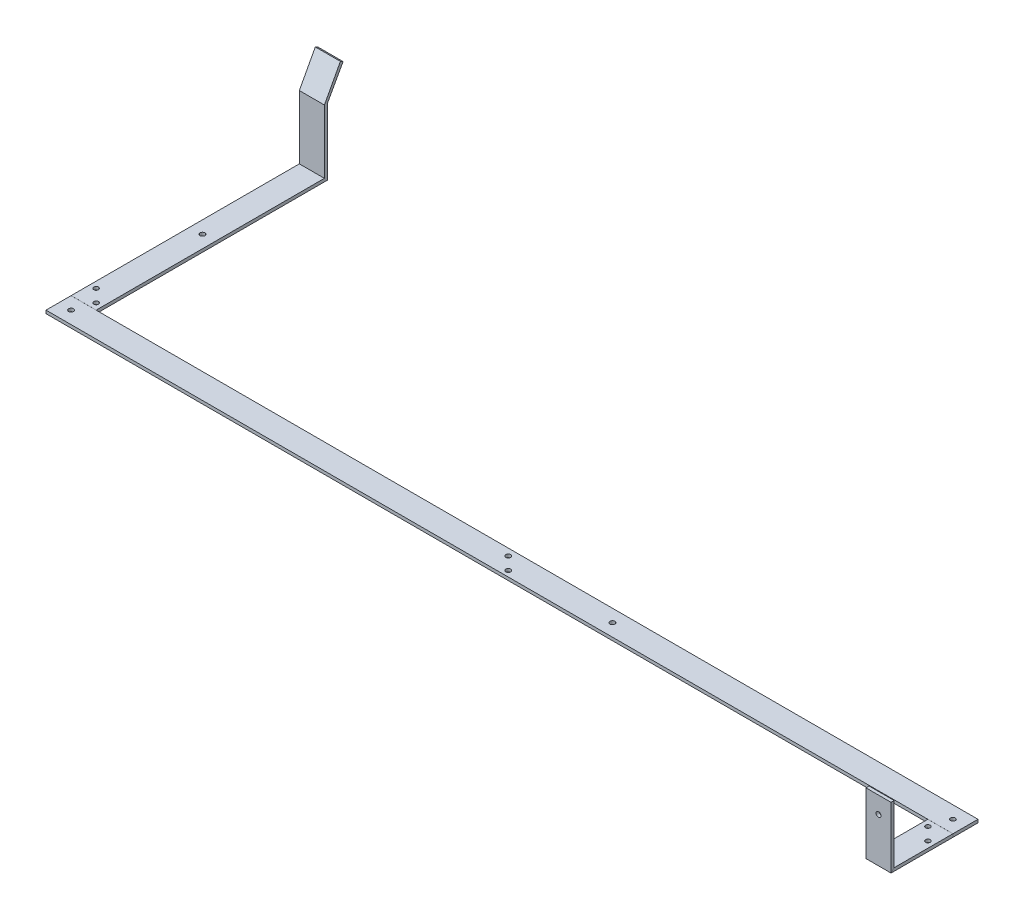
ISO-10303-21;
HEADER;
FILE_DESCRIPTION(('STEP AP214'),'2;1');
FILE_NAME('part.step','',(''),(''),'','','');
FILE_SCHEMA(('AUTOMOTIVE_DESIGN { 1 0 10303 214 1 1 1 1 }'));
ENDSEC;
DATA;
#1=APPLICATION_CONTEXT('core data for automotive mechanical design processes');
#2=APPLICATION_PROTOCOL_DEFINITION('international standard','automotive_design',2000,#1);
#3=PRODUCT_CONTEXT('',#1,'mechanical');
#4=PRODUCT('Part','Part','',(#3));
#5=PRODUCT_RELATED_PRODUCT_CATEGORY('part','',(#4));
#6=PRODUCT_DEFINITION_FORMATION('','',#4);
#7=PRODUCT_DEFINITION_CONTEXT('part definition',#1,'design');
#8=PRODUCT_DEFINITION('design','',#6,#7);
#9=PRODUCT_DEFINITION_SHAPE('','',#8);
#10=(LENGTH_UNIT() NAMED_UNIT(*) SI_UNIT(.MILLI.,.METRE.));
#11=(NAMED_UNIT(*) PLANE_ANGLE_UNIT() SI_UNIT($,.RADIAN.));
#12=(NAMED_UNIT(*) SI_UNIT($,.STERADIAN.) SOLID_ANGLE_UNIT());
#13=UNCERTAINTY_MEASURE_WITH_UNIT(LENGTH_MEASURE(1.E-05),#10,'distance_accuracy_value','');
#14=(GEOMETRIC_REPRESENTATION_CONTEXT(3) GLOBAL_UNCERTAINTY_ASSIGNED_CONTEXT((#13)) GLOBAL_UNIT_ASSIGNED_CONTEXT((#10,
#11,#12)) REPRESENTATION_CONTEXT('',''));
#15=CARTESIAN_POINT('',(0.,0.,0.));
#16=DIRECTION('',(0.,0.,1.));
#17=DIRECTION('',(1.,0.,0.));
#18=AXIS2_PLACEMENT_3D('',#15,#16,#17);
#19=CARTESIAN_POINT('',(-25.4,-67.5,6.31));
#20=DIRECTION('',(0.,1.,0.));
#21=DIRECTION('',(0.,0.,1.));
#22=AXIS2_PLACEMENT_3D('',#19,#20,#21);
#23=PLANE('',#22);
#24=CARTESIAN_POINT('',(1774.59999999998,-67.5,532.449999999998));
#25=DIRECTION('',(0.,-1.,0.));
#26=DIRECTION('',(0.,0.,-1.));
#27=AXIS2_PLACEMENT_3D('',#24,#25,#26);
#28=CIRCLE('',#27,4.76249999999989);
#29=CARTESIAN_POINT('',(1774.59999999998,-67.5,527.687499999998));
#30=VERTEX_POINT('',#29);
#31=EDGE_CURVE('E159',#30,#30,#28,.T.);
#32=ORIENTED_EDGE('',*,*,#31,.F.);
#33=EDGE_LOOP('',(#32));
#34=FACE_BOUND('',#33,.T.);
#35=CARTESIAN_POINT('',(1799.99999999998,-67.5,557.849999999998));
#36=DIRECTION('',(0.,-1.,0.));
#37=DIRECTION('',(0.,0.,-1.));
#38=AXIS2_PLACEMENT_3D('',#35,#36,#37);
#39=CIRCLE('',#38,4.76249999999989);
#40=CARTESIAN_POINT('',(1799.99999999998,-67.5,553.087499999998));
#41=VERTEX_POINT('',#40);
#42=EDGE_CURVE('E149',#41,#41,#39,.T.);
#43=ORIENTED_EDGE('',*,*,#42,.F.);
#44=EDGE_LOOP('',(#43));
#45=FACE_BOUND('',#44,.T.);
#46=DIRECTION('',(0.,0.,1.));
#47=VECTOR('',#46,1.);
#48=CARTESIAN_POINT('',(1761.9,-67.4999999999998,519.75));
#49=LINE('',#48,#47);
#50=CARTESIAN_POINT('',(1761.9,-67.4999999999998,519.85));
#51=VERTEX_POINT('',#50);
#52=CARTESIAN_POINT('',(1761.9,-67.4999999999998,645.215));
#53=VERTEX_POINT('',#52);
#54=EDGE_CURVE('E119',#51,#53,#49,.T.);
#55=ORIENTED_EDGE('',*,*,#54,.F.);
#56=DIRECTION('',(1.,0.,0.));
#57=VECTOR('',#56,1.);
#58=CARTESIAN_POINT('',(-25.4,-67.5,519.85));
#59=LINE('',#58,#57);
#60=CARTESIAN_POINT('',(1812.7,-67.4999999999998,519.85));
#61=VERTEX_POINT('',#60);
#62=EDGE_CURVE('E63',#51,#61,#59,.T.);
#63=ORIENTED_EDGE('',*,*,#62,.T.);
#64=DIRECTION('',(0.,0.,-1.));
#65=VECTOR('',#64,1.);
#66=CARTESIAN_POINT('',(1812.7,-67.4999999999998,468.95));
#67=LINE('',#66,#65);
#68=CARTESIAN_POINT('',(1812.7,-67.4999999999998,645.215));
#69=VERTEX_POINT('',#68);
#70=EDGE_CURVE('E140',#69,#61,#67,.T.);
#71=ORIENTED_EDGE('',*,*,#70,.F.);
#72=DIRECTION('',(-1.,0.,0.));
#73=VECTOR('',#72,1.);
#74=CARTESIAN_POINT('',(1761.9,-67.4999999999998,645.215));
#75=LINE('',#74,#73);
#76=EDGE_CURVE('E111',#69,#53,#75,.T.);
#77=ORIENTED_EDGE('',*,*,#76,.T.);
#78=EDGE_LOOP('',(#55,#63,#71,#77));
#79=FACE_BOUND('',#78,.T.);
#80=ADVANCED_FACE('F45',(#34,#45,#79),#23,.F.);
#81=CARTESIAN_POINT('',(-25.4,-61.19,519.75));
#82=DIRECTION('',(0.,-1.,0.));
#83=DIRECTION('',(0.,0.,-1.));
#84=AXIS2_PLACEMENT_3D('',#81,#82,#83);
#85=PLANE('',#84);
#86=CARTESIAN_POINT('',(1774.59999999998,-61.19,532.449999999998));
#87=DIRECTION('',(0.,-1.,0.));
#88=DIRECTION('',(0.,0.,-1.));
#89=AXIS2_PLACEMENT_3D('',#86,#87,#88);
#90=CIRCLE('',#89,4.76249999999989);
#91=CARTESIAN_POINT('',(1774.59999999998,-61.19,527.687499999998));
#92=VERTEX_POINT('',#91);
#93=EDGE_CURVE('E48',#92,#92,#90,.T.);
#94=ORIENTED_EDGE('',*,*,#93,.T.);
#95=EDGE_LOOP('',(#94));
#96=FACE_BOUND('',#95,.T.);
#97=CARTESIAN_POINT('',(1799.99999999998,-61.19,557.849999999998));
#98=DIRECTION('',(0.,-1.,0.));
#99=DIRECTION('',(0.,0.,-1.));
#100=AXIS2_PLACEMENT_3D('',#97,#98,#99);
#101=CIRCLE('',#100,4.76249999999989);
#102=CARTESIAN_POINT('',(1799.99999999998,-61.19,553.087499999998));
#103=VERTEX_POINT('',#102);
#104=EDGE_CURVE('E147',#103,#103,#101,.T.);
#105=ORIENTED_EDGE('',*,*,#104,.T.);
#106=EDGE_LOOP('',(#105));
#107=FACE_BOUND('',#106,.T.);
#108=DIRECTION('',(0.,0.,1.));
#109=VECTOR('',#108,1.);
#110=CARTESIAN_POINT('',(1812.7,-61.1899999999998,468.95));
#111=LINE('',#110,#109);
#112=CARTESIAN_POINT('',(1812.7,-61.19,519.85));
#113=VERTEX_POINT('',#112);
#114=CARTESIAN_POINT('',(1812.7,-61.1899999999998,638.905));
#115=VERTEX_POINT('',#114);
#116=EDGE_CURVE('E105',#113,#115,#111,.T.);
#117=ORIENTED_EDGE('',*,*,#116,.F.);
#118=DIRECTION('',(1.,0.,0.));
#119=VECTOR('',#118,1.);
#120=CARTESIAN_POINT('',(1812.7,-61.19,519.85));
#121=LINE('',#120,#119);
#122=CARTESIAN_POINT('',(1761.9,-61.19,519.85));
#123=VERTEX_POINT('',#122);
#124=EDGE_CURVE('E12',#123,#113,#121,.T.);
#125=ORIENTED_EDGE('',*,*,#124,.F.);
#126=DIRECTION('',(0.,0.,1.));
#127=VECTOR('',#126,1.);
#128=CARTESIAN_POINT('',(1761.9,-61.1899999999998,519.75));
#129=LINE('',#128,#127);
#130=CARTESIAN_POINT('',(1761.9,-61.1899999999998,638.905));
#131=VERTEX_POINT('',#130);
#132=EDGE_CURVE('E103',#123,#131,#129,.T.);
#133=ORIENTED_EDGE('',*,*,#132,.T.);
#134=DIRECTION('',(1.,0.,0.));
#135=VECTOR('',#134,1.);
#136=CARTESIAN_POINT('',(1761.9,-61.1899999999998,638.905));
#137=LINE('',#136,#135);
#138=EDGE_CURVE('E110',#131,#115,#137,.T.);
#139=ORIENTED_EDGE('',*,*,#138,.T.);
#140=EDGE_LOOP('',(#117,#125,#133,#139));
#141=FACE_BOUND('',#140,.T.);
#142=ADVANCED_FACE('F101',(#96,#107,#141),#85,.F.);
#143=CARTESIAN_POINT('',(1812.7,1.97302717093577E-13,0.));
#144=DIRECTION('',(1.,0.,0.));
#145=DIRECTION('',(0.,0.,-1.));
#146=AXIS2_PLACEMENT_3D('',#143,#144,#145);
#147=PLANE('',#146);
#148=DIRECTION('',(0.,1.,0.));
#149=VECTOR('',#148,1.);
#150=CARTESIAN_POINT('',(1812.7,-111.99,519.85));
#151=LINE('',#150,#149);
#152=EDGE_CURVE('E113',#61,#113,#151,.T.);
#153=ORIENTED_EDGE('',*,*,#152,.T.);
#154=ORIENTED_EDGE('',*,*,#116,.T.);
#155=DIRECTION('',(0.,-0.707106781186548,0.707106781186548));
#156=VECTOR('',#155,1.);
#157=CARTESIAN_POINT('',(1812.7,-1.61249999999979,579.3275));
#158=LINE('',#157,#156);
#159=EDGE_CURVE('E143',#115,#69,#158,.T.);
#160=ORIENTED_EDGE('',*,*,#159,.T.);
#161=ORIENTED_EDGE('',*,*,#70,.T.);
#162=EDGE_LOOP('',(#153,#154,#160,#161));
#163=FACE_BOUND('',#162,.T.);
#164=ADVANCED_FACE('F169',(#163),#147,.T.);
#165=CARTESIAN_POINT('',(1761.9,-67.9154999999999,638.905));
#166=DIRECTION('',(0.,0.,-1.));
#167=DIRECTION('',(-1.,0.,0.));
#168=AXIS2_PLACEMENT_3D('',#165,#166,#167);
#169=PLANE('',#168);
#170=CARTESIAN_POINT('',(1787.3,22.7162872600002,638.905));
#171=DIRECTION('',(0.,0.,-1.));
#172=DIRECTION('',(-1.,0.,0.));
#173=AXIS2_PLACEMENT_3D('',#170,#171,#172);
#174=CIRCLE('',#173,4.99999999999982);
#175=CARTESIAN_POINT('',(1782.3,22.7162872600002,638.905));
#176=VERTEX_POINT('',#175);
#177=EDGE_CURVE('E146',#176,#176,#174,.T.);
#178=ORIENTED_EDGE('',*,*,#177,.F.);
#179=EDGE_LOOP('',(#178));
#180=FACE_BOUND('',#179,.T.);
#181=DIRECTION('',(1.,0.,0.));
#182=VECTOR('',#181,1.);
#183=CARTESIAN_POINT('',(1739.7,56.7162872600002,638.905));
#184=LINE('',#183,#182);
#185=CARTESIAN_POINT('',(1761.9,56.7162872600002,638.905));
#186=VERTEX_POINT('',#185);
#187=CARTESIAN_POINT('',(1812.7,56.7162872600002,638.905));
#188=VERTEX_POINT('',#187);
#189=EDGE_CURVE('E134',#186,#188,#184,.T.);
#190=ORIENTED_EDGE('',*,*,#189,.T.);
#191=DIRECTION('',(0.,1.,0.));
#192=VECTOR('',#191,1.);
#193=CARTESIAN_POINT('',(1812.7,-67.9154999999999,638.905));
#194=LINE('',#193,#192);
#195=EDGE_CURVE('E122',#115,#188,#194,.T.);
#196=ORIENTED_EDGE('',*,*,#195,.F.);
#197=ORIENTED_EDGE('',*,*,#138,.F.);
#198=DIRECTION('',(0.,1.,0.));
#199=VECTOR('',#198,1.);
#200=CARTESIAN_POINT('',(1761.9,-67.9154999999999,638.905));
#201=LINE('',#200,#199);
#202=EDGE_CURVE('E126',#131,#186,#201,.T.);
#203=ORIENTED_EDGE('',*,*,#202,.T.);
#204=EDGE_LOOP('',(#190,#196,#197,#203));
#205=FACE_BOUND('',#204,.T.);
#206=ADVANCED_FACE('F176',(#180,#205),#169,.T.);
#207=CARTESIAN_POINT('',(1812.7,-67.9154999999999,638.905));
#208=DIRECTION('',(1.,0.,0.));
#209=DIRECTION('',(0.,0.,-1.));
#210=AXIS2_PLACEMENT_3D('',#207,#208,#209);
#211=PLANE('',#210);
#212=DIRECTION('',(0.,0.,-1.));
#213=VECTOR('',#212,1.);
#214=CARTESIAN_POINT('',(1812.7,56.7162872600002,645.215));
#215=LINE('',#214,#213);
#216=CARTESIAN_POINT('',(1812.7,56.7162872600002,645.215));
#217=VERTEX_POINT('',#216);
#218=EDGE_CURVE('E97',#217,#188,#215,.T.);
#219=ORIENTED_EDGE('',*,*,#218,.F.);
#220=DIRECTION('',(0.,1.,0.));
#221=VECTOR('',#220,1.);
#222=CARTESIAN_POINT('',(1812.7,-67.9154999999999,645.215));
#223=LINE('',#222,#221);
#224=EDGE_CURVE('E125',#69,#217,#223,.T.);
#225=ORIENTED_EDGE('',*,*,#224,.F.);
#226=ORIENTED_EDGE('',*,*,#159,.F.);
#227=ORIENTED_EDGE('',*,*,#195,.T.);
#228=EDGE_LOOP('',(#219,#225,#226,#227));
#229=FACE_BOUND('',#228,.T.);
#230=ADVANCED_FACE('F174',(#229),#211,.T.);
#231=CARTESIAN_POINT('',(1761.9,-67.9154999999999,645.215));
#232=DIRECTION('',(0.,0.,1.));
#233=DIRECTION('',(1.,0.,0.));
#234=AXIS2_PLACEMENT_3D('',#231,#232,#233);
#235=PLANE('',#234);
#236=CARTESIAN_POINT('',(1787.3,22.7162872600002,645.215));
#237=DIRECTION('',(0.,0.,1.));
#238=DIRECTION('',(1.,0.,0.));
#239=AXIS2_PLACEMENT_3D('',#236,#237,#238);
#240=CIRCLE('',#239,4.99999999999982);
#241=CARTESIAN_POINT('',(1792.3,22.7162872600002,645.215));
#242=VERTEX_POINT('',#241);
#243=EDGE_CURVE('E138',#242,#242,#240,.T.);
#244=ORIENTED_EDGE('',*,*,#243,.F.);
#245=EDGE_LOOP('',(#244));
#246=FACE_BOUND('',#245,.T.);
#247=DIRECTION('',(1.,0.,0.));
#248=VECTOR('',#247,1.);
#249=CARTESIAN_POINT('',(1739.7,56.7162872600002,645.215));
#250=LINE('',#249,#248);
#251=CARTESIAN_POINT('',(1761.9,56.7162872600002,645.215));
#252=VERTEX_POINT('',#251);
#253=EDGE_CURVE('E136',#252,#217,#250,.T.);
#254=ORIENTED_EDGE('',*,*,#253,.F.);
#255=DIRECTION('',(0.,1.,0.));
#256=VECTOR('',#255,1.);
#257=CARTESIAN_POINT('',(1761.9,-67.9154999999999,645.215));
#258=LINE('',#257,#256);
#259=EDGE_CURVE('E129',#53,#252,#258,.T.);
#260=ORIENTED_EDGE('',*,*,#259,.F.);
#261=ORIENTED_EDGE('',*,*,#76,.F.);
#262=ORIENTED_EDGE('',*,*,#224,.T.);
#263=EDGE_LOOP('',(#254,#260,#261,#262));
#264=FACE_BOUND('',#263,.T.);
#265=ADVANCED_FACE('F187',(#246,#264),#235,.T.);
#266=CARTESIAN_POINT('',(1761.9,-67.9154999999999,638.905));
#267=DIRECTION('',(-1.,0.,0.));
#268=DIRECTION('',(0.,0.,1.));
#269=AXIS2_PLACEMENT_3D('',#266,#267,#268);
#270=PLANE('',#269);
#271=DIRECTION('',(0.,0.,1.));
#272=VECTOR('',#271,1.);
#273=CARTESIAN_POINT('',(1761.9,56.7162872600002,638.905));
#274=LINE('',#273,#272);
#275=EDGE_CURVE('E121',#186,#252,#274,.T.);
#276=ORIENTED_EDGE('',*,*,#275,.F.);
#277=ORIENTED_EDGE('',*,*,#202,.F.);
#278=DIRECTION('',(0.,0.707106781186548,-0.707106781186548));
#279=VECTOR('',#278,1.);
#280=CARTESIAN_POINT('',(1761.9,-1.6124999999998,579.3275));
#281=LINE('',#280,#279);
#282=EDGE_CURVE('E109',#53,#131,#281,.T.);
#283=ORIENTED_EDGE('',*,*,#282,.F.);
#284=ORIENTED_EDGE('',*,*,#259,.T.);
#285=EDGE_LOOP('',(#276,#277,#283,#284));
#286=FACE_BOUND('',#285,.T.);
#287=ADVANCED_FACE('F183',(#286),#270,.T.);
#288=CARTESIAN_POINT('',(1761.9,-61.1899999999998,519.75));
#289=DIRECTION('',(-1.,0.,0.));
#290=DIRECTION('',(0.,0.,1.));
#291=AXIS2_PLACEMENT_3D('',#288,#289,#290);
#292=PLANE('',#291);
#293=DIRECTION('',(0.,1.,0.));
#294=VECTOR('',#293,1.);
#295=CARTESIAN_POINT('',(1761.9,-61.1899999999998,519.85));
#296=LINE('',#295,#294);
#297=EDGE_CURVE('E54',#51,#123,#296,.T.);
#298=ORIENTED_EDGE('',*,*,#297,.F.);
#299=ORIENTED_EDGE('',*,*,#54,.T.);
#300=ORIENTED_EDGE('',*,*,#282,.T.);
#301=ORIENTED_EDGE('',*,*,#132,.F.);
#302=EDGE_LOOP('',(#298,#299,#300,#301));
#303=FACE_BOUND('',#302,.T.);
#304=ADVANCED_FACE('F107',(#303),#292,.T.);
#305=CARTESIAN_POINT('',(1739.7,56.7162872600002,645.215));
#306=DIRECTION('',(0.,-1.,0.));
#307=DIRECTION('',(0.,0.,-1.));
#308=AXIS2_PLACEMENT_3D('',#305,#306,#307);
#309=PLANE('',#308);
#310=ORIENTED_EDGE('',*,*,#275,.T.);
#311=ORIENTED_EDGE('',*,*,#253,.T.);
#312=ORIENTED_EDGE('',*,*,#218,.T.);
#313=ORIENTED_EDGE('',*,*,#189,.F.);
#314=EDGE_LOOP('',(#310,#311,#312,#313));
#315=FACE_BOUND('',#314,.T.);
#316=ADVANCED_FACE('F180',(#315),#309,.F.);
#317=CARTESIAN_POINT('',(1812.7,-111.99,519.85));
#318=DIRECTION('',(0.,0.,1.));
#319=DIRECTION('',(1.,0.,0.));
#320=AXIS2_PLACEMENT_3D('',#317,#318,#319);
#321=PLANE('',#320);
#322=ORIENTED_EDGE('',*,*,#297,.T.);
#323=ORIENTED_EDGE('',*,*,#124,.T.);
#324=ORIENTED_EDGE('',*,*,#152,.F.);
#325=ORIENTED_EDGE('',*,*,#62,.F.);
#326=EDGE_LOOP('',(#322,#323,#324,#325));
#327=FACE_BOUND('',#326,.T.);
#328=ADVANCED_FACE('F93',(#327),#321,.F.);
#329=CARTESIAN_POINT('',(1787.3,22.7162872600002,671.905));
#330=DIRECTION('',(0.,0.,-1.));
#331=DIRECTION('',(-1.,0.,0.));
#332=AXIS2_PLACEMENT_3D('',#329,#330,#331);
#333=CYLINDRICAL_SURFACE('',#332,4.99999999999982);
#334=ORIENTED_EDGE('',*,*,#243,.T.);
#335=EDGE_LOOP('',(#334));
#336=FACE_BOUND('',#335,.T.);
#337=ORIENTED_EDGE('',*,*,#177,.T.);
#338=EDGE_LOOP('',(#337));
#339=FACE_BOUND('',#338,.T.);
#340=ADVANCED_FACE('F209',(#336,#339),#333,.F.);
#341=CARTESIAN_POINT('',(1799.99999999998,-17.5,557.849999999998));
#342=DIRECTION('',(0.,-1.,0.));
#343=DIRECTION('',(0.,0.,-1.));
#344=AXIS2_PLACEMENT_3D('',#341,#342,#343);
#345=CYLINDRICAL_SURFACE('',#344,4.76249999999989);
#346=ORIENTED_EDGE('',*,*,#42,.T.);
#347=EDGE_LOOP('',(#346));
#348=FACE_BOUND('',#347,.T.);
#349=ORIENTED_EDGE('',*,*,#104,.F.);
#350=EDGE_LOOP('',(#349));
#351=FACE_BOUND('',#350,.T.);
#352=ADVANCED_FACE('F203',(#348,#351),#345,.F.);
#353=CARTESIAN_POINT('',(1774.59999999998,-17.5,532.449999999998));
#354=DIRECTION('',(0.,-1.,0.));
#355=DIRECTION('',(0.,0.,-1.));
#356=AXIS2_PLACEMENT_3D('',#353,#354,#355);
#357=CYLINDRICAL_SURFACE('',#356,4.76249999999989);
#358=ORIENTED_EDGE('',*,*,#31,.T.);
#359=EDGE_LOOP('',(#358));
#360=FACE_BOUND('',#359,.T.);
#361=ORIENTED_EDGE('',*,*,#93,.F.);
#362=EDGE_LOOP('',(#361));
#363=FACE_BOUND('',#362,.T.);
#364=ADVANCED_FACE('F200',(#360,#363),#357,.F.);
#365=CLOSED_SHELL('',(#80,#142,#164,#206,#230,#265,#287,#304,#316,#328,#340,#352,#364));
#366=MANIFOLD_SOLID_BREP('B2',#365);
#367=CARTESIAN_POINT('',(1812.7,-67.4999999999998,468.95));
#368=DIRECTION('',(0.,0.,1.));
#369=DIRECTION('',(1.,0.,0.));
#370=AXIS2_PLACEMENT_3D('',#367,#368,#369);
#371=PLANE('',#370);
#372=DIRECTION('',(0.,1.,0.));
#373=VECTOR('',#372,1.);
#374=CARTESIAN_POINT('',(1812.7,-67.4999999999998,468.95));
#375=LINE('',#374,#373);
#376=CARTESIAN_POINT('',(1812.7,-67.4999999999998,468.95));
#377=VERTEX_POINT('',#376);
#378=CARTESIAN_POINT('',(1812.7,-61.1899999999998,468.95));
#379=VERTEX_POINT('',#378);
#380=EDGE_CURVE('E348',#377,#379,#375,.T.);
#381=ORIENTED_EDGE('',*,*,#380,.F.);
#382=DIRECTION('',(1.,0.,0.));
#383=VECTOR('',#382,1.);
#384=CARTESIAN_POINT('',(-25.4,-67.5,468.95));
#385=LINE('',#384,#383);
#386=CARTESIAN_POINT('',(-25.4,-67.5,468.95));
#387=VERTEX_POINT('',#386);
#388=EDGE_CURVE('E354',#387,#377,#385,.T.);
#389=ORIENTED_EDGE('',*,*,#388,.F.);
#390=DIRECTION('',(0.,1.,0.));
#391=VECTOR('',#390,1.);
#392=CARTESIAN_POINT('',(-25.4,-111.99,468.95));
#393=LINE('',#392,#391);
#394=CARTESIAN_POINT('',(-25.4,-61.19,468.95));
#395=VERTEX_POINT('',#394);
#396=EDGE_CURVE('E43',#387,#395,#393,.T.);
#397=ORIENTED_EDGE('',*,*,#396,.T.);
#398=DIRECTION('',(-1.,0.,0.));
#399=VECTOR('',#398,1.);
#400=CARTESIAN_POINT('',(1812.7,-61.1899999999998,468.95));
#401=LINE('',#400,#399);
#402=EDGE_CURVE('E388',#379,#395,#401,.T.);
#403=ORIENTED_EDGE('',*,*,#402,.F.);
#404=EDGE_LOOP('',(#381,#389,#397,#403));
#405=FACE_BOUND('',#404,.T.);
#406=ADVANCED_FACE('F338',(#405),#371,.F.);
#407=CARTESIAN_POINT('',(-25.4,67.5,6.31));
#408=DIRECTION('',(1.,0.,0.));
#409=DIRECTION('',(0.,1.,0.));
#410=AXIS2_PLACEMENT_3D('',#407,#408,#409);
#411=PLANE('',#410);
#412=DIRECTION('',(0.,0.,-1.));
#413=VECTOR('',#412,1.);
#414=CARTESIAN_POINT('',(-25.4,-61.19,519.75));
#415=LINE('',#414,#413);
#416=CARTESIAN_POINT('',(-25.4,-61.19,519.75));
#417=VERTEX_POINT('',#416);
#418=EDGE_CURVE('E342',#417,#395,#415,.T.);
#419=ORIENTED_EDGE('',*,*,#418,.T.);
#420=ORIENTED_EDGE('',*,*,#396,.F.);
#421=DIRECTION('',(0.,0.,-1.));
#422=VECTOR('',#421,1.);
#423=CARTESIAN_POINT('',(-25.4,-67.5,6.31));
#424=LINE('',#423,#422);
#425=CARTESIAN_POINT('',(-25.4,-67.5,519.75));
#426=VERTEX_POINT('',#425);
#427=EDGE_CURVE('E408',#426,#387,#424,.T.);
#428=ORIENTED_EDGE('',*,*,#427,.F.);
#429=DIRECTION('',(0.,-1.,0.));
#430=VECTOR('',#429,1.);
#431=CARTESIAN_POINT('',(-25.4,-61.19,519.75));
#432=LINE('',#431,#430);
#433=EDGE_CURVE('E387',#417,#426,#432,.T.);
#434=ORIENTED_EDGE('',*,*,#433,.F.);
#435=EDGE_LOOP('',(#419,#420,#428,#434));
#436=FACE_BOUND('',#435,.T.);
#437=ADVANCED_FACE('F340',(#436),#411,.F.);
#438=CARTESIAN_POINT('',(1812.7,1.97302717093577E-13,0.));
#439=DIRECTION('',(1.,0.,0.));
#440=DIRECTION('',(0.,0.,-1.));
#441=AXIS2_PLACEMENT_3D('',#438,#439,#440);
#442=PLANE('',#441);
#443=DIRECTION('',(0.,1.,0.));
#444=VECTOR('',#443,1.);
#445=CARTESIAN_POINT('',(1812.7,-111.99,519.75));
#446=LINE('',#445,#444);
#447=CARTESIAN_POINT('',(1812.7,-67.4999999999998,519.75));
#448=VERTEX_POINT('',#447);
#449=CARTESIAN_POINT('',(1812.7,-61.19,519.75));
#450=VERTEX_POINT('',#449);
#451=EDGE_CURVE('E391',#448,#450,#446,.T.);
#452=ORIENTED_EDGE('',*,*,#451,.F.);
#453=DIRECTION('',(0.,0.,-1.));
#454=VECTOR('',#453,1.);
#455=CARTESIAN_POINT('',(1812.7,-67.4999999999998,468.95));
#456=LINE('',#455,#454);
#457=EDGE_CURVE('E401',#448,#377,#456,.T.);
#458=ORIENTED_EDGE('',*,*,#457,.T.);
#459=ORIENTED_EDGE('',*,*,#380,.T.);
#460=DIRECTION('',(0.,0.,1.));
#461=VECTOR('',#460,1.);
#462=CARTESIAN_POINT('',(1812.7,-61.1899999999998,468.95));
#463=LINE('',#462,#461);
#464=EDGE_CURVE('E382',#379,#450,#463,.T.);
#465=ORIENTED_EDGE('',*,*,#464,.T.);
#466=EDGE_LOOP('',(#452,#458,#459,#465));
#467=FACE_BOUND('',#466,.T.);
#468=ADVANCED_FACE('F399',(#467),#442,.T.);
#469=CARTESIAN_POINT('',(0.,0.,519.75));
#470=DIRECTION('',(0.,0.,1.));
#471=DIRECTION('',(1.,0.,0.));
#472=AXIS2_PLACEMENT_3D('',#469,#470,#471);
#473=PLANE('',#472);
#474=DIRECTION('',(1.,0.,0.));
#475=VECTOR('',#474,1.);
#476=CARTESIAN_POINT('',(-25.4,-67.5,519.75));
#477=LINE('',#476,#475);
#478=EDGE_CURVE('E394',#426,#448,#477,.T.);
#479=ORIENTED_EDGE('',*,*,#478,.T.);
#480=ORIENTED_EDGE('',*,*,#451,.T.);
#481=DIRECTION('',(-1.,0.,0.));
#482=VECTOR('',#481,1.);
#483=CARTESIAN_POINT('',(-25.4,-61.19,519.75));
#484=LINE('',#483,#482);
#485=EDGE_CURVE('E378',#450,#417,#484,.T.);
#486=ORIENTED_EDGE('',*,*,#485,.T.);
#487=ORIENTED_EDGE('',*,*,#433,.T.);
#488=EDGE_LOOP('',(#479,#480,#486,#487));
#489=FACE_BOUND('',#488,.T.);
#490=ADVANCED_FACE('F392',(#489),#473,.T.);
#491=CARTESIAN_POINT('',(-25.4,-61.19,519.75));
#492=DIRECTION('',(0.,-1.,0.));
#493=DIRECTION('',(0.,0.,-1.));
#494=AXIS2_PLACEMENT_3D('',#491,#492,#493);
#495=PLANE('',#494);
#496=CARTESIAN_POINT('',(-1.11743947428522E-10,-61.19,494.350000000015));
#497=DIRECTION('',(0.,-1.,0.));
#498=DIRECTION('',(0.,0.,-1.));
#499=AXIS2_PLACEMENT_3D('',#496,#497,#498);
#500=CIRCLE('',#499,4.9999999998805);
#501=CARTESIAN_POINT('',(-1.11743947428522E-10,-61.19,489.350000000135));
#502=VERTEX_POINT('',#501);
#503=EDGE_CURVE('E437',#502,#502,#500,.T.);
#504=ORIENTED_EDGE('',*,*,#503,.T.);
#505=EDGE_LOOP('',(#504));
#506=FACE_BOUND('',#505,.T.);
#507=CARTESIAN_POINT('',(1787.3,-61.19,494.35));
#508=DIRECTION('',(0.,-1.,0.));
#509=DIRECTION('',(0.,0.,-1.));
#510=AXIS2_PLACEMENT_3D('',#507,#508,#509);
#511=CIRCLE('',#510,4.76249999999989);
#512=CARTESIAN_POINT('',(1787.3,-61.19,489.5875));
#513=VERTEX_POINT('',#512);
#514=EDGE_CURVE('E431',#513,#513,#511,.T.);
#515=ORIENTED_EDGE('',*,*,#514,.T.);
#516=EDGE_LOOP('',(#515));
#517=FACE_BOUND('',#516,.T.);
#518=CARTESIAN_POINT('',(874.599999999054,-61.19,482.844999999998));
#519=DIRECTION('',(0.,-1.,0.));
#520=DIRECTION('',(0.,0.,-1.));
#521=AXIS2_PLACEMENT_3D('',#518,#519,#520);
#522=CIRCLE('',#521,5.00000000001435);
#523=CARTESIAN_POINT('',(874.599999999054,-61.19,477.844999999983));
#524=VERTEX_POINT('',#523);
#525=EDGE_CURVE('E425',#524,#524,#522,.T.);
#526=ORIENTED_EDGE('',*,*,#525,.T.);
#527=EDGE_LOOP('',(#526));
#528=FACE_BOUND('',#527,.T.);
#529=CARTESIAN_POINT('',(899.999999999054,-61.19,508.244999999998));
#530=DIRECTION('',(0.,-1.,0.));
#531=DIRECTION('',(0.,0.,-1.));
#532=AXIS2_PLACEMENT_3D('',#529,#530,#531);
#533=CIRCLE('',#532,5.00000000001427);
#534=CARTESIAN_POINT('',(899.999999999054,-61.19,503.244999999984));
#535=VERTEX_POINT('',#534);
#536=EDGE_CURVE('E419',#535,#535,#533,.T.);
#537=ORIENTED_EDGE('',*,*,#536,.T.);
#538=EDGE_LOOP('',(#537));
#539=FACE_BOUND('',#538,.T.);
#540=CARTESIAN_POINT('',(1097.29999999906,-61.19,494.349999999999));
#541=DIRECTION('',(0.,-1.,0.));
#542=DIRECTION('',(0.,0.,-1.));
#543=AXIS2_PLACEMENT_3D('',#540,#541,#542);
#544=CIRCLE('',#543,4.99999999999982);
#545=CARTESIAN_POINT('',(1097.29999999906,-61.19,489.35));
#546=VERTEX_POINT('',#545);
#547=EDGE_CURVE('E397',#546,#546,#544,.T.);
#548=ORIENTED_EDGE('',*,*,#547,.T.);
#549=EDGE_LOOP('',(#548));
#550=FACE_BOUND('',#549,.T.);
#551=ORIENTED_EDGE('',*,*,#485,.F.);
#552=ORIENTED_EDGE('',*,*,#464,.F.);
#553=ORIENTED_EDGE('',*,*,#402,.T.);
#554=ORIENTED_EDGE('',*,*,#418,.F.);
#555=EDGE_LOOP('',(#551,#552,#553,#554));
#556=FACE_BOUND('',#555,.T.);
#557=ADVANCED_FACE('F380',(#506,#517,#528,#539,#550,#556),#495,.F.);
#558=CARTESIAN_POINT('',(-25.4,-67.5,6.31));
#559=DIRECTION('',(0.,1.,0.));
#560=DIRECTION('',(0.,0.,1.));
#561=AXIS2_PLACEMENT_3D('',#558,#559,#560);
#562=PLANE('',#561);
#563=CARTESIAN_POINT('',(-1.11743947428522E-10,-67.5,494.350000000015));
#564=DIRECTION('',(0.,-1.,0.));
#565=DIRECTION('',(0.,0.,-1.));
#566=AXIS2_PLACEMENT_3D('',#563,#564,#565);
#567=CIRCLE('',#566,4.9999999998805);
#568=CARTESIAN_POINT('',(-1.11743947428522E-10,-67.5,489.350000000135));
#569=VERTEX_POINT('',#568);
#570=EDGE_CURVE('E440',#569,#569,#567,.T.);
#571=ORIENTED_EDGE('',*,*,#570,.F.);
#572=EDGE_LOOP('',(#571));
#573=FACE_BOUND('',#572,.T.);
#574=CARTESIAN_POINT('',(1787.3,-67.5,494.35));
#575=DIRECTION('',(0.,-1.,0.));
#576=DIRECTION('',(0.,0.,-1.));
#577=AXIS2_PLACEMENT_3D('',#574,#575,#576);
#578=CIRCLE('',#577,4.76249999999989);
#579=CARTESIAN_POINT('',(1787.3,-67.5,489.5875));
#580=VERTEX_POINT('',#579);
#581=EDGE_CURVE('E434',#580,#580,#578,.T.);
#582=ORIENTED_EDGE('',*,*,#581,.F.);
#583=EDGE_LOOP('',(#582));
#584=FACE_BOUND('',#583,.T.);
#585=CARTESIAN_POINT('',(874.599999999054,-67.5,482.844999999998));
#586=DIRECTION('',(0.,-1.,0.));
#587=DIRECTION('',(0.,0.,-1.));
#588=AXIS2_PLACEMENT_3D('',#585,#586,#587);
#589=CIRCLE('',#588,5.00000000001435);
#590=CARTESIAN_POINT('',(874.599999999054,-67.5,477.844999999983));
#591=VERTEX_POINT('',#590);
#592=EDGE_CURVE('E428',#591,#591,#589,.T.);
#593=ORIENTED_EDGE('',*,*,#592,.F.);
#594=EDGE_LOOP('',(#593));
#595=FACE_BOUND('',#594,.T.);
#596=CARTESIAN_POINT('',(899.999999999054,-67.5,508.244999999998));
#597=DIRECTION('',(0.,-1.,0.));
#598=DIRECTION('',(0.,0.,-1.));
#599=AXIS2_PLACEMENT_3D('',#596,#597,#598);
#600=CIRCLE('',#599,5.00000000001427);
#601=CARTESIAN_POINT('',(899.999999999054,-67.5,503.244999999984));
#602=VERTEX_POINT('',#601);
#603=EDGE_CURVE('E422',#602,#602,#600,.T.);
#604=ORIENTED_EDGE('',*,*,#603,.F.);
#605=EDGE_LOOP('',(#604));
#606=FACE_BOUND('',#605,.T.);
#607=CARTESIAN_POINT('',(1097.29999999906,-67.5,494.349999999999));
#608=DIRECTION('',(0.,-1.,0.));
#609=DIRECTION('',(0.,0.,-1.));
#610=AXIS2_PLACEMENT_3D('',#607,#608,#609);
#611=CIRCLE('',#610,4.99999999999982);
#612=CARTESIAN_POINT('',(1097.29999999906,-67.5,489.35));
#613=VERTEX_POINT('',#612);
#614=EDGE_CURVE('E416',#613,#613,#611,.T.);
#615=ORIENTED_EDGE('',*,*,#614,.F.);
#616=EDGE_LOOP('',(#615));
#617=FACE_BOUND('',#616,.T.);
#618=ORIENTED_EDGE('',*,*,#457,.F.);
#619=ORIENTED_EDGE('',*,*,#478,.F.);
#620=ORIENTED_EDGE('',*,*,#427,.T.);
#621=ORIENTED_EDGE('',*,*,#388,.T.);
#622=EDGE_LOOP('',(#618,#619,#620,#621));
#623=FACE_BOUND('',#622,.T.);
#624=ADVANCED_FACE('F447',(#573,#584,#595,#606,#617,#623),#562,.F.);
#625=CARTESIAN_POINT('',(1097.29999999906,-34.5,494.349999999999));
#626=DIRECTION('',(0.,-1.,0.));
#627=DIRECTION('',(0.,0.,-1.));
#628=AXIS2_PLACEMENT_3D('',#625,#626,#627);
#629=CYLINDRICAL_SURFACE('',#628,4.99999999999982);
#630=ORIENTED_EDGE('',*,*,#614,.T.);
#631=EDGE_LOOP('',(#630));
#632=FACE_BOUND('',#631,.T.);
#633=ORIENTED_EDGE('',*,*,#547,.F.);
#634=EDGE_LOOP('',(#633));
#635=FACE_BOUND('',#634,.T.);
#636=ADVANCED_FACE('F450',(#632,#635),#629,.F.);
#637=CARTESIAN_POINT('',(899.999999999054,-57.5,508.244999999998));
#638=DIRECTION('',(0.,-1.,0.));
#639=DIRECTION('',(0.,0.,-1.));
#640=AXIS2_PLACEMENT_3D('',#637,#638,#639);
#641=CYLINDRICAL_SURFACE('',#640,5.00000000001427);
#642=ORIENTED_EDGE('',*,*,#603,.T.);
#643=EDGE_LOOP('',(#642));
#644=FACE_BOUND('',#643,.T.);
#645=ORIENTED_EDGE('',*,*,#536,.F.);
#646=EDGE_LOOP('',(#645));
#647=FACE_BOUND('',#646,.T.);
#648=ADVANCED_FACE('F485',(#644,#647),#641,.F.);
#649=CARTESIAN_POINT('',(874.599999999054,-57.5,482.844999999998));
#650=DIRECTION('',(0.,-1.,0.));
#651=DIRECTION('',(0.,0.,-1.));
#652=AXIS2_PLACEMENT_3D('',#649,#650,#651);
#653=CYLINDRICAL_SURFACE('',#652,5.00000000001435);
#654=ORIENTED_EDGE('',*,*,#592,.T.);
#655=EDGE_LOOP('',(#654));
#656=FACE_BOUND('',#655,.T.);
#657=ORIENTED_EDGE('',*,*,#525,.F.);
#658=EDGE_LOOP('',(#657));
#659=FACE_BOUND('',#658,.T.);
#660=ADVANCED_FACE('F491',(#656,#659),#653,.F.);
#661=CARTESIAN_POINT('',(1787.3,-17.5,494.35));
#662=DIRECTION('',(0.,-1.,0.));
#663=DIRECTION('',(0.,0.,-1.));
#664=AXIS2_PLACEMENT_3D('',#661,#662,#663);
#665=CYLINDRICAL_SURFACE('',#664,4.76249999999989);
#666=ORIENTED_EDGE('',*,*,#581,.T.);
#667=EDGE_LOOP('',(#666));
#668=FACE_BOUND('',#667,.T.);
#669=ORIENTED_EDGE('',*,*,#514,.F.);
#670=EDGE_LOOP('',(#669));
#671=FACE_BOUND('',#670,.T.);
#672=ADVANCED_FACE('F497',(#668,#671),#665,.F.);
#673=CARTESIAN_POINT('',(-1.11743947428522E-10,-17.5,494.350000000015));
#674=DIRECTION('',(0.,-1.,0.));
#675=DIRECTION('',(0.,0.,-1.));
#676=AXIS2_PLACEMENT_3D('',#673,#674,#675);
#677=CYLINDRICAL_SURFACE('',#676,4.9999999998805);
#678=ORIENTED_EDGE('',*,*,#570,.T.);
#679=EDGE_LOOP('',(#678));
#680=FACE_BOUND('',#679,.T.);
#681=ORIENTED_EDGE('',*,*,#503,.F.);
#682=EDGE_LOOP('',(#681));
#683=FACE_BOUND('',#682,.T.);
#684=ADVANCED_FACE('F444',(#680,#683),#677,.F.);
#685=CLOSED_SHELL('',(#406,#437,#468,#490,#557,#624,#636,#648,#660,#672,#684));
#686=MANIFOLD_SOLID_BREP('B6',#685);
#687=CARTESIAN_POINT('',(72.6,67.5,0.));
#688=DIRECTION('',(0.,-0.482874158352215,-0.875689755104877));
#689=DIRECTION('',(0.,0.875689755104877,-0.482874158352215));
#690=AXIS2_PLACEMENT_3D('',#687,#688,#689);
#691=PLANE('',#690);
#692=DIRECTION('',(0.,0.875689755104877,-0.482874158352215));
#693=VECTOR('',#692,1.);
#694=CARTESIAN_POINT('',(25.4,67.5,0.));
#695=LINE('',#694,#693);
#696=CARTESIAN_POINT('',(25.4,67.5,0.));
#697=VERTEX_POINT('',#696);
#698=CARTESIAN_POINT('',(25.4,124.808722595379,-31.6012617804008));
#699=VERTEX_POINT('',#698);
#700=EDGE_CURVE('E720',#697,#699,#695,.T.);
#701=ORIENTED_EDGE('',*,*,#700,.F.);
#702=DIRECTION('',(-1.,0.,0.));
#703=VECTOR('',#702,1.);
#704=CARTESIAN_POINT('',(-25.4,67.5,0.));
#705=LINE('',#704,#703);
#706=CARTESIAN_POINT('',(-25.4,67.5,0.));
#707=VERTEX_POINT('',#706);
#708=EDGE_CURVE('E700',#697,#707,#705,.T.);
#709=ORIENTED_EDGE('',*,*,#708,.T.);
#710=DIRECTION('',(0.,-0.875689755104877,0.482874158352215));
#711=VECTOR('',#710,1.);
#712=CARTESIAN_POINT('',(-25.4,67.5,0.));
#713=LINE('',#712,#711);
#714=CARTESIAN_POINT('',(-25.4,124.808722595379,-31.6012617804008));
#715=VERTEX_POINT('',#714);
#716=EDGE_CURVE('E719',#715,#707,#713,.T.);
#717=ORIENTED_EDGE('',*,*,#716,.F.);
#718=DIRECTION('',(-1.,0.,0.));
#719=VECTOR('',#718,1.);
#720=CARTESIAN_POINT('',(72.6,124.808722595379,-31.6012617804008));
#721=LINE('',#720,#719);
#722=EDGE_CURVE('E687',#699,#715,#721,.T.);
#723=ORIENTED_EDGE('',*,*,#722,.F.);
#724=EDGE_LOOP('',(#701,#709,#717,#723));
#725=FACE_BOUND('',#724,.T.);
#726=ADVANCED_FACE('F599',(#725),#691,.T.);
#727=CARTESIAN_POINT('',(72.6,124.808722595379,-31.6012617804008));
#728=DIRECTION('',(0.,0.875689755104877,-0.482874158352215));
#729=DIRECTION('',(0.,0.482874158352215,0.875689755104877));
#730=AXIS2_PLACEMENT_3D('',#727,#728,#729);
#731=PLANE('',#730);
#732=DIRECTION('',(0.,0.482874158352215,0.875689755104877));
#733=VECTOR('',#732,1.);
#734=CARTESIAN_POINT('',(25.4,124.808722595379,-31.6012617804008));
#735=LINE('',#734,#733);
#736=CARTESIAN_POINT('',(25.4,127.855658534582,-26.075659425689));
#737=VERTEX_POINT('',#736);
#738=EDGE_CURVE('E622',#699,#737,#735,.T.);
#739=ORIENTED_EDGE('',*,*,#738,.F.);
#740=ORIENTED_EDGE('',*,*,#722,.T.);
#741=DIRECTION('',(0.,-0.482874158352215,-0.875689755104877));
#742=VECTOR('',#741,1.);
#743=CARTESIAN_POINT('',(-25.4,124.808722595379,-31.6012617804008));
#744=LINE('',#743,#742);
#745=CARTESIAN_POINT('',(-25.4,127.855658534582,-26.075659425689));
#746=VERTEX_POINT('',#745);
#747=EDGE_CURVE('E724',#746,#715,#744,.T.);
#748=ORIENTED_EDGE('',*,*,#747,.F.);
#749=DIRECTION('',(-1.,0.,0.));
#750=VECTOR('',#749,1.);
#751=CARTESIAN_POINT('',(72.6,127.855658534582,-26.075659425689));
#752=LINE('',#751,#750);
#753=EDGE_CURVE('E725',#737,#746,#752,.T.);
#754=ORIENTED_EDGE('',*,*,#753,.F.);
#755=EDGE_LOOP('',(#739,#740,#748,#754));
#756=FACE_BOUND('',#755,.T.);
#757=ADVANCED_FACE('F732',(#756),#731,.T.);
#758=CARTESIAN_POINT('',(72.6,127.855658534582,-26.075659425689));
#759=DIRECTION('',(0.,0.472814262273008,0.881162115272343));
#760=DIRECTION('',(0.,-0.881162115272344,0.472814262273008));
#761=AXIS2_PLACEMENT_3D('',#758,#759,#760);
#762=PLANE('',#761);
#763=DIRECTION('',(0.,-0.881162115272343,0.472814262273009));
#764=VECTOR('',#763,1.);
#765=CARTESIAN_POINT('',(25.4,67.5,6.31));
#766=LINE('',#765,#764);
#767=CARTESIAN_POINT('',(25.4,67.5,6.31));
#768=VERTEX_POINT('',#767);
#769=EDGE_CURVE('E734',#737,#768,#766,.T.);
#770=ORIENTED_EDGE('',*,*,#769,.F.);
#771=ORIENTED_EDGE('',*,*,#753,.T.);
#772=DIRECTION('',(0.,0.881162115272344,-0.472814262273008));
#773=VECTOR('',#772,1.);
#774=CARTESIAN_POINT('',(-25.4,127.855658534582,-26.075659425689));
#775=LINE('',#774,#773);
#776=CARTESIAN_POINT('',(-25.4,67.5,6.31));
#777=VERTEX_POINT('',#776);
#778=EDGE_CURVE('E727',#777,#746,#775,.T.);
#779=ORIENTED_EDGE('',*,*,#778,.F.);
#780=DIRECTION('',(-1.,0.,0.));
#781=VECTOR('',#780,1.);
#782=CARTESIAN_POINT('',(-25.4,67.5,6.31));
#783=LINE('',#782,#781);
#784=EDGE_CURVE('E694',#768,#777,#783,.T.);
#785=ORIENTED_EDGE('',*,*,#784,.F.);
#786=EDGE_LOOP('',(#770,#771,#779,#785));
#787=FACE_BOUND('',#786,.T.);
#788=ADVANCED_FACE('F742',(#787),#762,.T.);
#789=CARTESIAN_POINT('',(0.,0.,0.));
#790=DIRECTION('',(0.,0.,1.));
#791=DIRECTION('',(1.,0.,0.));
#792=AXIS2_PLACEMENT_3D('',#789,#790,#791);
#793=PLANE('',#792);
#794=DIRECTION('',(0.,1.,0.));
#795=VECTOR('',#794,1.);
#796=CARTESIAN_POINT('',(25.4,67.5,0.));
#797=LINE('',#796,#795);
#798=CARTESIAN_POINT('',(25.4,-67.5,0.));
#799=VERTEX_POINT('',#798);
#800=EDGE_CURVE('E685',#799,#697,#797,.T.);
#801=ORIENTED_EDGE('',*,*,#800,.F.);
#802=DIRECTION('',(1.,0.,0.));
#803=VECTOR('',#802,1.);
#804=CARTESIAN_POINT('',(-25.4,-67.5,0.));
#805=LINE('',#804,#803);
#806=CARTESIAN_POINT('',(-25.4,-67.5,0.));
#807=VERTEX_POINT('',#806);
#808=EDGE_CURVE('E695',#807,#799,#805,.T.);
#809=ORIENTED_EDGE('',*,*,#808,.F.);
#810=DIRECTION('',(0.,-1.,0.));
#811=VECTOR('',#810,1.);
#812=CARTESIAN_POINT('',(-25.4,67.5,0.));
#813=LINE('',#812,#811);
#814=EDGE_CURVE('E703',#707,#807,#813,.T.);
#815=ORIENTED_EDGE('',*,*,#814,.F.);
#816=ORIENTED_EDGE('',*,*,#708,.F.);
#817=EDGE_LOOP('',(#801,#809,#815,#816));
#818=FACE_BOUND('',#817,.T.);
#819=ADVANCED_FACE('F714',(#818),#793,.F.);
#820=CARTESIAN_POINT('',(0.,0.,6.31));
#821=DIRECTION('',(0.,0.,1.));
#822=DIRECTION('',(1.,0.,0.));
#823=AXIS2_PLACEMENT_3D('',#820,#821,#822);
#824=PLANE('',#823);
#825=DIRECTION('',(-1.,0.,0.));
#826=VECTOR('',#825,1.);
#827=CARTESIAN_POINT('',(-25.4,-61.19,6.31));
#828=LINE('',#827,#826);
#829=CARTESIAN_POINT('',(25.4,-61.19,6.31));
#830=VERTEX_POINT('',#829);
#831=CARTESIAN_POINT('',(-25.4,-61.19,6.31));
#832=VERTEX_POINT('',#831);
#833=EDGE_CURVE('E682',#830,#832,#828,.T.);
#834=ORIENTED_EDGE('',*,*,#833,.F.);
#835=DIRECTION('',(0.,1.,0.));
#836=VECTOR('',#835,1.);
#837=CARTESIAN_POINT('',(25.4,67.5,6.31));
#838=LINE('',#837,#836);
#839=EDGE_CURVE('E691',#830,#768,#838,.T.);
#840=ORIENTED_EDGE('',*,*,#839,.T.);
#841=ORIENTED_EDGE('',*,*,#784,.T.);
#842=DIRECTION('',(0.,-1.,0.));
#843=VECTOR('',#842,1.);
#844=CARTESIAN_POINT('',(-25.4,67.5,6.31));
#845=LINE('',#844,#843);
#846=EDGE_CURVE('E697',#777,#832,#845,.T.);
#847=ORIENTED_EDGE('',*,*,#846,.T.);
#848=EDGE_LOOP('',(#834,#840,#841,#847));
#849=FACE_BOUND('',#848,.T.);
#850=ADVANCED_FACE('F745',(#849),#824,.T.);
#851=CARTESIAN_POINT('',(-25.4,-61.19,519.75));
#852=DIRECTION('',(0.,-1.,0.));
#853=DIRECTION('',(0.,0.,-1.));
#854=AXIS2_PLACEMENT_3D('',#851,#852,#853);
#855=PLANE('',#854);
#856=CARTESIAN_POINT('',(-1.09967590589122E-10,-61.19,227.952204665911));
#857=DIRECTION('',(0.,-1.,0.));
#858=DIRECTION('',(0.,0.,-1.));
#859=AXIS2_PLACEMENT_3D('',#856,#857,#858);
#860=CIRCLE('',#859,4.99999999987889);
#861=CARTESIAN_POINT('',(-1.09967590589122E-10,-61.19,222.952204666033));
#862=VERTEX_POINT('',#861);
#863=EDGE_CURVE('E903',#862,#862,#860,.T.);
#864=ORIENTED_EDGE('',*,*,#863,.T.);
#865=EDGE_LOOP('',(#864));
#866=FACE_BOUND('',#865,.T.);
#867=CARTESIAN_POINT('',(12.6999999999999,-61.19,456.249999999999));
#868=DIRECTION('',(0.,-1.,0.));
#869=DIRECTION('',(0.,0.,-1.));
#870=AXIS2_PLACEMENT_3D('',#867,#868,#869);
#871=CIRCLE('',#870,4.7625);
#872=CARTESIAN_POINT('',(12.6999999999999,-61.19,451.487499999999));
#873=VERTEX_POINT('',#872);
#874=EDGE_CURVE('E894',#873,#873,#871,.T.);
#875=ORIENTED_EDGE('',*,*,#874,.T.);
#876=EDGE_LOOP('',(#875));
#877=FACE_BOUND('',#876,.T.);
#878=CARTESIAN_POINT('',(-12.7000000000002,-61.19,430.849999999999));
#879=DIRECTION('',(0.,-1.,0.));
#880=DIRECTION('',(0.,0.,-1.));
#881=AXIS2_PLACEMENT_3D('',#878,#879,#880);
#882=CIRCLE('',#881,4.76250000000001);
#883=CARTESIAN_POINT('',(-12.7000000000002,-61.19,426.087499999999));
#884=VERTEX_POINT('',#883);
#885=EDGE_CURVE('E668',#884,#884,#882,.T.);
#886=ORIENTED_EDGE('',*,*,#885,.T.);
#887=EDGE_LOOP('',(#886));
#888=FACE_BOUND('',#887,.T.);
#889=DIRECTION('',(0.,0.,-1.));
#890=VECTOR('',#889,1.);
#891=CARTESIAN_POINT('',(-25.4,-61.19,519.75));
#892=LINE('',#891,#890);
#893=CARTESIAN_POINT('',(-25.4,-61.19,468.85));
#894=VERTEX_POINT('',#893);
#895=EDGE_CURVE('E674',#894,#832,#892,.T.);
#896=ORIENTED_EDGE('',*,*,#895,.F.);
#897=DIRECTION('',(-1.,0.,0.));
#898=VECTOR('',#897,1.);
#899=CARTESIAN_POINT('',(-25.4,-61.19,468.85));
#900=LINE('',#899,#898);
#901=CARTESIAN_POINT('',(25.4,-61.19,468.85));
#902=VERTEX_POINT('',#901);
#903=EDGE_CURVE('E660',#902,#894,#900,.T.);
#904=ORIENTED_EDGE('',*,*,#903,.F.);
#905=DIRECTION('',(0.,0.,-1.));
#906=VECTOR('',#905,1.);
#907=CARTESIAN_POINT('',(25.4,-61.19,519.75));
#908=LINE('',#907,#906);
#909=EDGE_CURVE('E683',#902,#830,#908,.T.);
#910=ORIENTED_EDGE('',*,*,#909,.T.);
#911=ORIENTED_EDGE('',*,*,#833,.T.);
#912=EDGE_LOOP('',(#896,#904,#910,#911));
#913=FACE_BOUND('',#912,.T.);
#914=ADVANCED_FACE('F680',(#866,#877,#888,#913),#855,.F.);
#915=CARTESIAN_POINT('',(-25.4,-67.5,6.31));
#916=DIRECTION('',(0.,1.,0.));
#917=DIRECTION('',(0.,0.,1.));
#918=AXIS2_PLACEMENT_3D('',#915,#916,#917);
#919=PLANE('',#918);
#920=CARTESIAN_POINT('',(-1.09967590589122E-10,-67.5,227.952204665911));
#921=DIRECTION('',(0.,-1.,0.));
#922=DIRECTION('',(0.,0.,-1.));
#923=AXIS2_PLACEMENT_3D('',#920,#921,#922);
#924=CIRCLE('',#923,4.99999999987889);
#925=CARTESIAN_POINT('',(-1.09967590589122E-10,-67.5,222.952204666033));
#926=VERTEX_POINT('',#925);
#927=EDGE_CURVE('E886',#926,#926,#924,.T.);
#928=ORIENTED_EDGE('',*,*,#927,.F.);
#929=EDGE_LOOP('',(#928));
#930=FACE_BOUND('',#929,.T.);
#931=CARTESIAN_POINT('',(12.6999999999999,-67.5,456.249999999999));
#932=DIRECTION('',(0.,-1.,0.));
#933=DIRECTION('',(0.,0.,-1.));
#934=AXIS2_PLACEMENT_3D('',#931,#932,#933);
#935=CIRCLE('',#934,4.7625);
#936=CARTESIAN_POINT('',(12.6999999999999,-67.5,451.487499999999));
#937=VERTEX_POINT('',#936);
#938=EDGE_CURVE('E890',#937,#937,#935,.T.);
#939=ORIENTED_EDGE('',*,*,#938,.F.);
#940=EDGE_LOOP('',(#939));
#941=FACE_BOUND('',#940,.T.);
#942=CARTESIAN_POINT('',(-12.7000000000002,-67.5,430.849999999999));
#943=DIRECTION('',(0.,-1.,0.));
#944=DIRECTION('',(0.,0.,-1.));
#945=AXIS2_PLACEMENT_3D('',#942,#943,#944);
#946=CIRCLE('',#945,4.76250000000001);
#947=CARTESIAN_POINT('',(-12.7000000000002,-67.5,426.087499999999));
#948=VERTEX_POINT('',#947);
#949=EDGE_CURVE('E893',#948,#948,#946,.T.);
#950=ORIENTED_EDGE('',*,*,#949,.F.);
#951=EDGE_LOOP('',(#950));
#952=FACE_BOUND('',#951,.T.);
#953=DIRECTION('',(0.,0.,-1.));
#954=VECTOR('',#953,1.);
#955=CARTESIAN_POINT('',(25.4,-67.5,6.31));
#956=LINE('',#955,#954);
#957=CARTESIAN_POINT('',(25.4,-67.5,468.85));
#958=VERTEX_POINT('',#957);
#959=EDGE_CURVE('E607',#958,#799,#956,.T.);
#960=ORIENTED_EDGE('',*,*,#959,.F.);
#961=DIRECTION('',(-1.,0.,0.));
#962=VECTOR('',#961,1.);
#963=CARTESIAN_POINT('',(-25.4,-67.5,468.85));
#964=LINE('',#963,#962);
#965=CARTESIAN_POINT('',(-25.4,-67.5,468.85));
#966=VERTEX_POINT('',#965);
#967=EDGE_CURVE('E677',#958,#966,#964,.T.);
#968=ORIENTED_EDGE('',*,*,#967,.T.);
#969=DIRECTION('',(0.,0.,-1.));
#970=VECTOR('',#969,1.);
#971=CARTESIAN_POINT('',(-25.4,-67.5,6.31));
#972=LINE('',#971,#970);
#973=EDGE_CURVE('E336',#966,#807,#972,.T.);
#974=ORIENTED_EDGE('',*,*,#973,.T.);
#975=ORIENTED_EDGE('',*,*,#808,.T.);
#976=EDGE_LOOP('',(#960,#968,#974,#975));
#977=FACE_BOUND('',#976,.T.);
#978=ADVANCED_FACE('F711',(#930,#941,#952,#977),#919,.F.);
#979=CARTESIAN_POINT('',(-25.4,67.5,6.31));
#980=DIRECTION('',(1.,0.,0.));
#981=DIRECTION('',(0.,1.,0.));
#982=AXIS2_PLACEMENT_3D('',#979,#980,#981);
#983=PLANE('',#982);
#984=ORIENTED_EDGE('',*,*,#973,.F.);
#985=DIRECTION('',(0.,1.,0.));
#986=VECTOR('',#985,1.);
#987=CARTESIAN_POINT('',(-25.4,-111.99,468.85));
#988=LINE('',#987,#986);
#989=EDGE_CURVE('E663',#966,#894,#988,.T.);
#990=ORIENTED_EDGE('',*,*,#989,.T.);
#991=ORIENTED_EDGE('',*,*,#895,.T.);
#992=ORIENTED_EDGE('',*,*,#846,.F.);
#993=ORIENTED_EDGE('',*,*,#778,.T.);
#994=ORIENTED_EDGE('',*,*,#747,.T.);
#995=ORIENTED_EDGE('',*,*,#716,.T.);
#996=ORIENTED_EDGE('',*,*,#814,.T.);
#997=EDGE_LOOP('',(#984,#990,#991,#992,#993,#994,#995,#996));
#998=FACE_BOUND('',#997,.T.);
#999=ADVANCED_FACE('F672',(#998),#983,.F.);
#1000=CARTESIAN_POINT('',(25.4,67.5,6.31));
#1001=DIRECTION('',(-1.,0.,0.));
#1002=DIRECTION('',(0.,-1.,0.));
#1003=AXIS2_PLACEMENT_3D('',#1000,#1001,#1002);
#1004=PLANE('',#1003);
#1005=ORIENTED_EDGE('',*,*,#909,.F.);
#1006=DIRECTION('',(0.,1.,0.));
#1007=VECTOR('',#1006,1.);
#1008=CARTESIAN_POINT('',(25.4,-111.99,468.85));
#1009=LINE('',#1008,#1007);
#1010=EDGE_CURVE('E614',#958,#902,#1009,.T.);
#1011=ORIENTED_EDGE('',*,*,#1010,.F.);
#1012=ORIENTED_EDGE('',*,*,#959,.T.);
#1013=ORIENTED_EDGE('',*,*,#800,.T.);
#1014=ORIENTED_EDGE('',*,*,#700,.T.);
#1015=ORIENTED_EDGE('',*,*,#738,.T.);
#1016=ORIENTED_EDGE('',*,*,#769,.T.);
#1017=ORIENTED_EDGE('',*,*,#839,.F.);
#1018=EDGE_LOOP('',(#1005,#1011,#1012,#1013,#1014,#1015,#1016,#1017));
#1019=FACE_BOUND('',#1018,.T.);
#1020=ADVANCED_FACE('F601',(#1019),#1004,.F.);
#1021=CARTESIAN_POINT('',(-25.4,-111.99,468.85));
#1022=DIRECTION('',(0.,0.,-1.));
#1023=DIRECTION('',(-1.,0.,0.));
#1024=AXIS2_PLACEMENT_3D('',#1021,#1022,#1023);
#1025=PLANE('',#1024);
#1026=ORIENTED_EDGE('',*,*,#1010,.T.);
#1027=ORIENTED_EDGE('',*,*,#903,.T.);
#1028=ORIENTED_EDGE('',*,*,#989,.F.);
#1029=ORIENTED_EDGE('',*,*,#967,.F.);
#1030=EDGE_LOOP('',(#1026,#1027,#1028,#1029));
#1031=FACE_BOUND('',#1030,.T.);
#1032=ADVANCED_FACE('F662',(#1031),#1025,.F.);
#1033=CARTESIAN_POINT('',(-12.7000000000002,-57.5,430.849999999999));
#1034=DIRECTION('',(0.,-1.,0.));
#1035=DIRECTION('',(0.,0.,-1.));
#1036=AXIS2_PLACEMENT_3D('',#1033,#1034,#1035);
#1037=CYLINDRICAL_SURFACE('',#1036,4.76250000000001);
#1038=ORIENTED_EDGE('',*,*,#949,.T.);
#1039=EDGE_LOOP('',(#1038));
#1040=FACE_BOUND('',#1039,.T.);
#1041=ORIENTED_EDGE('',*,*,#885,.F.);
#1042=EDGE_LOOP('',(#1041));
#1043=FACE_BOUND('',#1042,.T.);
#1044=ADVANCED_FACE('F810',(#1040,#1043),#1037,.F.);
#1045=CARTESIAN_POINT('',(12.6999999999999,-57.5,456.249999999999));
#1046=DIRECTION('',(0.,-1.,0.));
#1047=DIRECTION('',(0.,0.,-1.));
#1048=AXIS2_PLACEMENT_3D('',#1045,#1046,#1047);
#1049=CYLINDRICAL_SURFACE('',#1048,4.7625);
#1050=ORIENTED_EDGE('',*,*,#938,.T.);
#1051=EDGE_LOOP('',(#1050));
#1052=FACE_BOUND('',#1051,.T.);
#1053=ORIENTED_EDGE('',*,*,#874,.F.);
#1054=EDGE_LOOP('',(#1053));
#1055=FACE_BOUND('',#1054,.T.);
#1056=ADVANCED_FACE('F817',(#1052,#1055),#1049,.F.);
#1057=CARTESIAN_POINT('',(-1.09967590589122E-10,-17.5,227.952204665911));
#1058=DIRECTION('',(0.,-1.,0.));
#1059=DIRECTION('',(0.,0.,-1.));
#1060=AXIS2_PLACEMENT_3D('',#1057,#1058,#1059);
#1061=CYLINDRICAL_SURFACE('',#1060,4.99999999987889);
#1062=ORIENTED_EDGE('',*,*,#927,.T.);
#1063=EDGE_LOOP('',(#1062));
#1064=FACE_BOUND('',#1063,.T.);
#1065=ORIENTED_EDGE('',*,*,#863,.F.);
#1066=EDGE_LOOP('',(#1065));
#1067=FACE_BOUND('',#1066,.T.);
#1068=ADVANCED_FACE('F825',(#1064,#1067),#1061,.F.);
#1069=CLOSED_SHELL('',(#726,#757,#788,#819,#850,#914,#978,#999,#1020,#1032,#1044,#1056,#1068));
#1070=MANIFOLD_SOLID_BREP('B37',#1069);
#1071=ADVANCED_BREP_SHAPE_REPRESENTATION('',(#18,#366,#686,#1070),#14);
#1072=SHAPE_DEFINITION_REPRESENTATION(#9,#1071);
ENDSEC;
END-ISO-10303-21;
